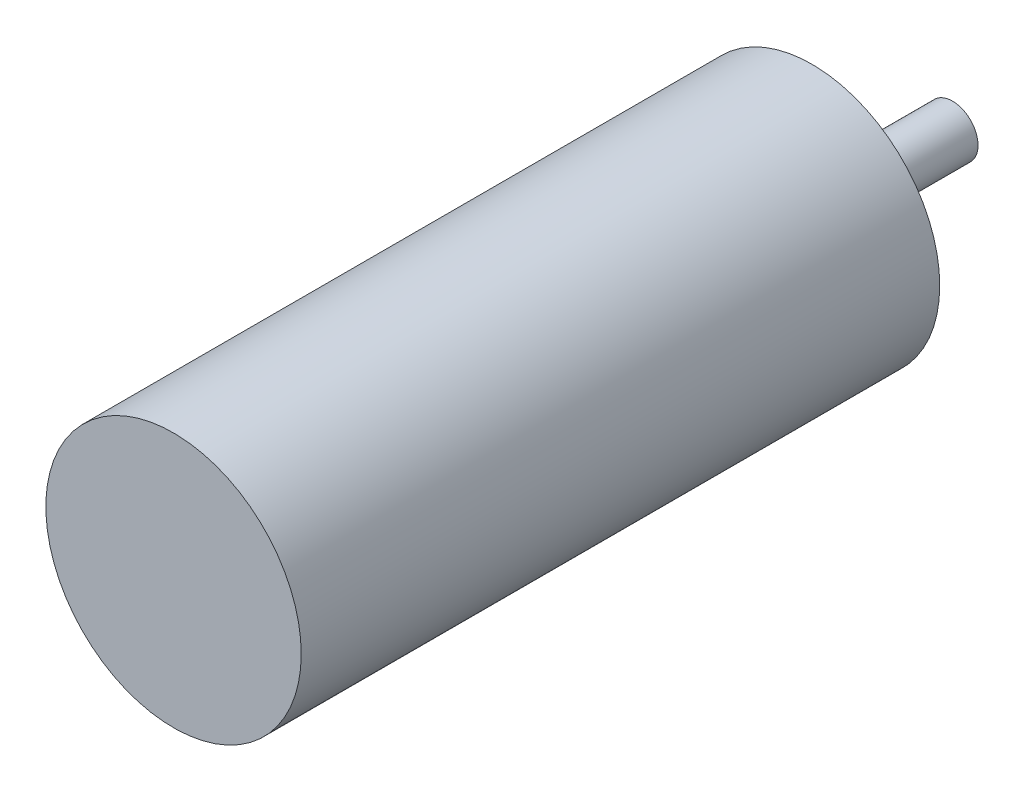
ISO-10303-21;
HEADER;
FILE_DESCRIPTION(('STEP AP214'),'2;1');
FILE_NAME('part.step','',(''),(''),'','','');
FILE_SCHEMA(('AUTOMOTIVE_DESIGN { 1 0 10303 214 1 1 1 1 }'));
ENDSEC;
DATA;
#1=APPLICATION_CONTEXT('core data for automotive mechanical design processes');
#2=APPLICATION_PROTOCOL_DEFINITION('international standard','automotive_design',2000,#1);
#3=PRODUCT_CONTEXT('',#1,'mechanical');
#4=PRODUCT('Part','Part','',(#3));
#5=PRODUCT_RELATED_PRODUCT_CATEGORY('part','',(#4));
#6=PRODUCT_DEFINITION_FORMATION('','',#4);
#7=PRODUCT_DEFINITION_CONTEXT('part definition',#1,'design');
#8=PRODUCT_DEFINITION('design','',#6,#7);
#9=PRODUCT_DEFINITION_SHAPE('','',#8);
#10=(LENGTH_UNIT() NAMED_UNIT(*) SI_UNIT(.MILLI.,.METRE.));
#11=(NAMED_UNIT(*) PLANE_ANGLE_UNIT() SI_UNIT($,.RADIAN.));
#12=(NAMED_UNIT(*) SI_UNIT($,.STERADIAN.) SOLID_ANGLE_UNIT());
#13=UNCERTAINTY_MEASURE_WITH_UNIT(LENGTH_MEASURE(1.E-05),#10,'distance_accuracy_value','');
#14=(GEOMETRIC_REPRESENTATION_CONTEXT(3) GLOBAL_UNCERTAINTY_ASSIGNED_CONTEXT((#13)) GLOBAL_UNIT_ASSIGNED_CONTEXT((#10,
#11,#12)) REPRESENTATION_CONTEXT('',''));
#15=CARTESIAN_POINT('',(0.,0.,0.));
#16=DIRECTION('',(0.,0.,1.));
#17=DIRECTION('',(1.,0.,0.));
#18=AXIS2_PLACEMENT_3D('',#15,#16,#17);
#19=CARTESIAN_POINT('',(0.,0.,125.));
#20=DIRECTION('',(0.,0.,-1.));
#21=DIRECTION('',(-1.,0.,0.));
#22=AXIS2_PLACEMENT_3D('',#19,#20,#21);
#23=CYLINDRICAL_SURFACE('',#22,25.);
#24=CARTESIAN_POINT('',(0.,0.,125.));
#25=DIRECTION('',(0.,0.,1.));
#26=DIRECTION('',(1.,0.,0.));
#27=AXIS2_PLACEMENT_3D('',#24,#25,#26);
#28=CIRCLE('',#27,25.);
#29=CARTESIAN_POINT('',(25.,0.,125.));
#30=VERTEX_POINT('',#29);
#31=EDGE_CURVE('E37',#30,#30,#28,.T.);
#32=ORIENTED_EDGE('',*,*,#31,.F.);
#33=EDGE_LOOP('',(#32));
#34=FACE_BOUND('',#33,.T.);
#35=CARTESIAN_POINT('',(0.,0.,0.));
#36=DIRECTION('',(0.,0.,1.));
#37=DIRECTION('',(1.,0.,0.));
#38=AXIS2_PLACEMENT_3D('',#35,#36,#37);
#39=CIRCLE('',#38,25.);
#40=CARTESIAN_POINT('',(25.,0.,0.));
#41=VERTEX_POINT('',#40);
#42=EDGE_CURVE('E41',#41,#41,#39,.T.);
#43=ORIENTED_EDGE('',*,*,#42,.T.);
#44=EDGE_LOOP('',(#43));
#45=FACE_BOUND('',#44,.T.);
#46=ADVANCED_FACE('F31',(#34,#45),#23,.T.);
#47=CARTESIAN_POINT('',(0.,0.,125.));
#48=DIRECTION('',(0.,0.,1.));
#49=DIRECTION('',(1.,0.,0.));
#50=AXIS2_PLACEMENT_3D('',#47,#48,#49);
#51=PLANE('',#50);
#52=ORIENTED_EDGE('',*,*,#31,.T.);
#53=EDGE_LOOP('',(#52));
#54=FACE_BOUND('',#53,.T.);
#55=ADVANCED_FACE('F78',(#54),#51,.T.);
#56=CARTESIAN_POINT('',(0.,0.,0.));
#57=DIRECTION('',(0.,0.,1.));
#58=DIRECTION('',(1.,0.,0.));
#59=AXIS2_PLACEMENT_3D('',#56,#57,#58);
#60=PLANE('',#59);
#61=CARTESIAN_POINT('',(0.,0.,0.));
#62=DIRECTION('',(0.,0.,1.));
#63=DIRECTION('',(1.,0.,0.));
#64=AXIS2_PLACEMENT_3D('',#61,#62,#63);
#65=CIRCLE('',#64,12.5);
#66=CARTESIAN_POINT('',(12.5,0.,0.));
#67=VERTEX_POINT('',#66);
#68=EDGE_CURVE('E10',#67,#67,#65,.F.);
#69=ORIENTED_EDGE('',*,*,#68,.F.);
#70=EDGE_LOOP('',(#69));
#71=FACE_BOUND('',#70,.T.);
#72=ORIENTED_EDGE('',*,*,#42,.F.);
#73=EDGE_LOOP('',(#72));
#74=FACE_BOUND('',#73,.T.);
#75=ADVANCED_FACE('F73',(#71,#74),#60,.F.);
#76=CARTESIAN_POINT('',(0.,0.,-2.5));
#77=DIRECTION('',(0.,0.,1.));
#78=DIRECTION('',(1.,0.,0.));
#79=AXIS2_PLACEMENT_3D('',#76,#77,#78);
#80=CYLINDRICAL_SURFACE('',#79,12.5);
#81=CARTESIAN_POINT('',(0.,0.,-2.5));
#82=DIRECTION('',(0.,0.,-1.));
#83=DIRECTION('',(-1.,0.,0.));
#84=AXIS2_PLACEMENT_3D('',#81,#82,#83);
#85=CIRCLE('',#84,12.5);
#86=CARTESIAN_POINT('',(-12.5,0.,-2.5));
#87=VERTEX_POINT('',#86);
#88=EDGE_CURVE('E46',#87,#87,#85,.T.);
#89=ORIENTED_EDGE('',*,*,#88,.F.);
#90=EDGE_LOOP('',(#89));
#91=FACE_BOUND('',#90,.T.);
#92=ORIENTED_EDGE('',*,*,#68,.T.);
#93=EDGE_LOOP('',(#92));
#94=FACE_BOUND('',#93,.T.);
#95=ADVANCED_FACE('F68',(#91,#94),#80,.T.);
#96=CARTESIAN_POINT('',(0.,0.,-2.5));
#97=DIRECTION('',(0.,0.,-1.));
#98=DIRECTION('',(-1.,0.,0.));
#99=AXIS2_PLACEMENT_3D('',#96,#97,#98);
#100=PLANE('',#99);
#101=CARTESIAN_POINT('',(0.,0.,-2.5));
#102=DIRECTION('',(0.,0.,-1.));
#103=DIRECTION('',(-1.,0.,0.));
#104=AXIS2_PLACEMENT_3D('',#101,#102,#103);
#105=CIRCLE('',#104,5.);
#106=CARTESIAN_POINT('',(-5.,0.,-2.5));
#107=VERTEX_POINT('',#106);
#108=EDGE_CURVE('E51',#107,#107,#105,.T.);
#109=ORIENTED_EDGE('',*,*,#108,.F.);
#110=EDGE_LOOP('',(#109));
#111=FACE_BOUND('',#110,.T.);
#112=ORIENTED_EDGE('',*,*,#88,.T.);
#113=EDGE_LOOP('',(#112));
#114=FACE_BOUND('',#113,.T.);
#115=ADVANCED_FACE('F62',(#111,#114),#100,.T.);
#116=CARTESIAN_POINT('',(0.,0.,-27.5));
#117=DIRECTION('',(0.,0.,1.));
#118=DIRECTION('',(1.,0.,0.));
#119=AXIS2_PLACEMENT_3D('',#116,#117,#118);
#120=CYLINDRICAL_SURFACE('',#119,5.);
#121=CARTESIAN_POINT('',(0.,0.,-27.5));
#122=DIRECTION('',(0.,0.,-1.));
#123=DIRECTION('',(-1.,0.,0.));
#124=AXIS2_PLACEMENT_3D('',#121,#122,#123);
#125=CIRCLE('',#124,5.);
#126=CARTESIAN_POINT('',(-5.,0.,-27.5));
#127=VERTEX_POINT('',#126);
#128=EDGE_CURVE('E50',#127,#127,#125,.T.);
#129=ORIENTED_EDGE('',*,*,#128,.F.);
#130=EDGE_LOOP('',(#129));
#131=FACE_BOUND('',#130,.T.);
#132=ORIENTED_EDGE('',*,*,#108,.T.);
#133=EDGE_LOOP('',(#132));
#134=FACE_BOUND('',#133,.T.);
#135=ADVANCED_FACE('F59',(#131,#134),#120,.T.);
#136=CARTESIAN_POINT('',(0.,0.,-27.5));
#137=DIRECTION('',(0.,0.,-1.));
#138=DIRECTION('',(-1.,0.,0.));
#139=AXIS2_PLACEMENT_3D('',#136,#137,#138);
#140=PLANE('',#139);
#141=ORIENTED_EDGE('',*,*,#128,.T.);
#142=EDGE_LOOP('',(#141));
#143=FACE_BOUND('',#142,.T.);
#144=ADVANCED_FACE('F57',(#143),#140,.T.);
#145=CLOSED_SHELL('',(#46,#55,#75,#95,#115,#135,#144));
#146=MANIFOLD_SOLID_BREP('B2',#145);
#147=ADVANCED_BREP_SHAPE_REPRESENTATION('',(#18,#146),#14);
#148=SHAPE_DEFINITION_REPRESENTATION(#9,#147);
ENDSEC;
END-ISO-10303-21;
